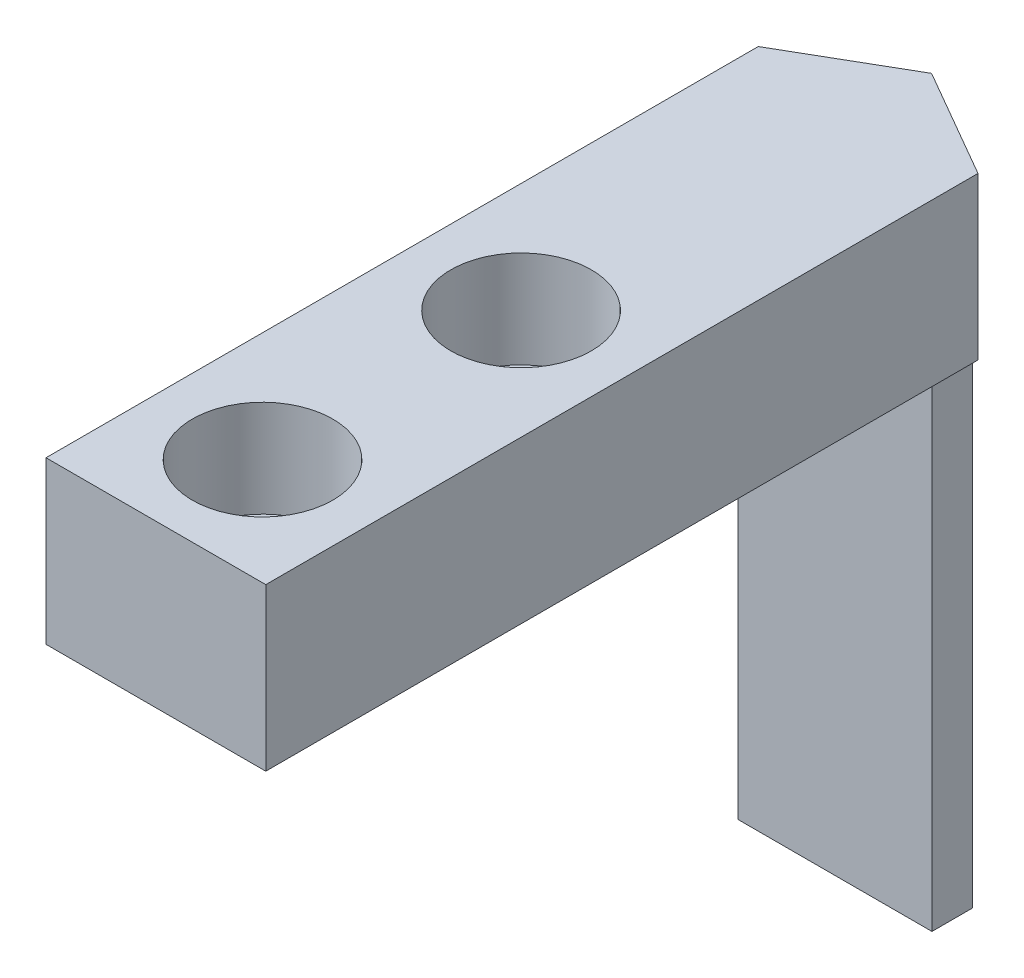
ISO-10303-21;
HEADER;
FILE_DESCRIPTION(('STEP AP214'),'2;1');
FILE_NAME('part.step','',(''),(''),'','','');
FILE_SCHEMA(('AUTOMOTIVE_DESIGN { 1 0 10303 214 1 1 1 1 }'));
ENDSEC;
DATA;
#1=APPLICATION_CONTEXT('core data for automotive mechanical design processes');
#2=APPLICATION_PROTOCOL_DEFINITION('international standard','automotive_design',2000,#1);
#3=PRODUCT_CONTEXT('',#1,'mechanical');
#4=PRODUCT('Part','Part','',(#3));
#5=PRODUCT_RELATED_PRODUCT_CATEGORY('part','',(#4));
#6=PRODUCT_DEFINITION_FORMATION('','',#4);
#7=PRODUCT_DEFINITION_CONTEXT('part definition',#1,'design');
#8=PRODUCT_DEFINITION('design','',#6,#7);
#9=PRODUCT_DEFINITION_SHAPE('','',#8);
#10=(LENGTH_UNIT() NAMED_UNIT(*) SI_UNIT(.MILLI.,.METRE.));
#11=(NAMED_UNIT(*) PLANE_ANGLE_UNIT() SI_UNIT($,.RADIAN.));
#12=(NAMED_UNIT(*) SI_UNIT($,.STERADIAN.) SOLID_ANGLE_UNIT());
#13=UNCERTAINTY_MEASURE_WITH_UNIT(LENGTH_MEASURE(1.E-05),#10,'distance_accuracy_value','');
#14=(GEOMETRIC_REPRESENTATION_CONTEXT(3) GLOBAL_UNCERTAINTY_ASSIGNED_CONTEXT((#13)) GLOBAL_UNIT_ASSIGNED_CONTEXT((#10,
#11,#12)) REPRESENTATION_CONTEXT('',''));
#15=CARTESIAN_POINT('',(0.,0.,0.));
#16=DIRECTION('',(0.,0.,1.));
#17=DIRECTION('',(1.,0.,0.));
#18=AXIS2_PLACEMENT_3D('',#15,#16,#17);
#19=CARTESIAN_POINT('',(0.,-5.,20.7));
#20=DIRECTION('',(0.,1.,0.));
#21=DIRECTION('',(-1.,0.,0.));
#22=AXIS2_PLACEMENT_3D('',#19,#20,#21);
#23=CYLINDRICAL_SURFACE('',#22,2.175);
#24=CARTESIAN_POINT('',(0.,0.,20.7));
#25=DIRECTION('',(0.,-1.,0.));
#26=DIRECTION('',(1.,0.,0.));
#27=AXIS2_PLACEMENT_3D('',#24,#25,#26);
#28=CIRCLE('',#27,2.175);
#29=CARTESIAN_POINT('',(2.175,0.,20.7));
#30=VERTEX_POINT('',#29);
#31=EDGE_CURVE('E11',#30,#30,#28,.T.);
#32=ORIENTED_EDGE('',*,*,#31,.F.);
#33=EDGE_LOOP('',(#32));
#34=FACE_BOUND('',#33,.T.);
#35=CARTESIAN_POINT('',(0.,-3.,20.7));
#36=DIRECTION('',(0.,-1.,0.));
#37=DIRECTION('',(1.,0.,0.));
#38=AXIS2_PLACEMENT_3D('',#35,#36,#37);
#39=CIRCLE('',#38,2.175);
#40=CARTESIAN_POINT('',(2.175,-3.,20.7));
#41=VERTEX_POINT('',#40);
#42=EDGE_CURVE('E25',#41,#41,#39,.T.);
#43=ORIENTED_EDGE('',*,*,#42,.T.);
#44=EDGE_LOOP('',(#43));
#45=FACE_BOUND('',#44,.T.);
#46=ADVANCED_FACE('F17',(#34,#45),#23,.F.);
#47=CARTESIAN_POINT('',(0.,-5.,12.7));
#48=DIRECTION('',(0.,1.,0.));
#49=DIRECTION('',(-1.,0.,0.));
#50=AXIS2_PLACEMENT_3D('',#47,#48,#49);
#51=CYLINDRICAL_SURFACE('',#50,2.175);
#52=CARTESIAN_POINT('',(0.,0.,12.7));
#53=DIRECTION('',(0.,-1.,0.));
#54=DIRECTION('',(1.,0.,0.));
#55=AXIS2_PLACEMENT_3D('',#52,#53,#54);
#56=CIRCLE('',#55,2.175);
#57=CARTESIAN_POINT('',(2.175,0.,12.7));
#58=VERTEX_POINT('',#57);
#59=EDGE_CURVE('E213',#58,#58,#56,.T.);
#60=ORIENTED_EDGE('',*,*,#59,.F.);
#61=EDGE_LOOP('',(#60));
#62=FACE_BOUND('',#61,.T.);
#63=CARTESIAN_POINT('',(0.,-3.,12.7));
#64=DIRECTION('',(0.,-1.,0.));
#65=DIRECTION('',(1.,0.,0.));
#66=AXIS2_PLACEMENT_3D('',#63,#64,#65);
#67=CIRCLE('',#66,2.175);
#68=CARTESIAN_POINT('',(2.175,-3.,12.7));
#69=VERTEX_POINT('',#68);
#70=EDGE_CURVE('E209',#69,#69,#67,.T.);
#71=ORIENTED_EDGE('',*,*,#70,.T.);
#72=EDGE_LOOP('',(#71));
#73=FACE_BOUND('',#72,.T.);
#74=ADVANCED_FACE('F240',(#62,#73),#51,.F.);
#75=CARTESIAN_POINT('',(0.,-5.,0.));
#76=DIRECTION('',(0.,-1.,0.));
#77=DIRECTION('',(1.,0.,0.));
#78=AXIS2_PLACEMENT_3D('',#75,#76,#77);
#79=PLANE('',#78);
#80=DIRECTION('',(0.,0.,-1.));
#81=VECTOR('',#80,1.);
#82=CARTESIAN_POINT('',(3.,-5.,0.));
#83=LINE('',#82,#81);
#84=CARTESIAN_POINT('',(3.,-5.,2.98776399621542));
#85=VERTEX_POINT('',#84);
#86=CARTESIAN_POINT('',(3.,-5.,1.73205080756885));
#87=VERTEX_POINT('',#86);
#88=EDGE_CURVE('E32',#85,#87,#83,.T.);
#89=ORIENTED_EDGE('',*,*,#88,.T.);
#90=DIRECTION('',(0.866025403784439,0.,0.499999999999999));
#91=VECTOR('',#90,1.);
#92=CARTESIAN_POINT('',(0.,-5.,0.));
#93=LINE('',#92,#91);
#94=CARTESIAN_POINT('',(3.4,-5.,1.9629909152447));
#95=VERTEX_POINT('',#94);
#96=EDGE_CURVE('E37',#87,#95,#93,.T.);
#97=ORIENTED_EDGE('',*,*,#96,.T.);
#98=DIRECTION('',(0.,0.,1.));
#99=VECTOR('',#98,1.);
#100=CARTESIAN_POINT('',(3.4,-5.,0.));
#101=LINE('',#100,#99);
#102=CARTESIAN_POINT('',(3.4,-5.,24.));
#103=VERTEX_POINT('',#102);
#104=EDGE_CURVE('E202',#95,#103,#101,.T.);
#105=ORIENTED_EDGE('',*,*,#104,.T.);
#106=DIRECTION('',(-1.,0.,0.));
#107=VECTOR('',#106,1.);
#108=CARTESIAN_POINT('',(-3.4,-5.,24.));
#109=LINE('',#108,#107);
#110=CARTESIAN_POINT('',(-3.4,-5.,24.));
#111=VERTEX_POINT('',#110);
#112=EDGE_CURVE('E199',#103,#111,#109,.T.);
#113=ORIENTED_EDGE('',*,*,#112,.T.);
#114=DIRECTION('',(0.,0.,-1.));
#115=VECTOR('',#114,1.);
#116=CARTESIAN_POINT('',(-3.4,-5.,24.));
#117=LINE('',#116,#115);
#118=CARTESIAN_POINT('',(-3.4,-5.,1.9629909152447));
#119=VERTEX_POINT('',#118);
#120=EDGE_CURVE('E196',#111,#119,#117,.T.);
#121=ORIENTED_EDGE('',*,*,#120,.T.);
#122=DIRECTION('',(0.866025403784439,0.,-0.499999999999999));
#123=VECTOR('',#122,1.);
#124=CARTESIAN_POINT('',(0.,-5.,0.));
#125=LINE('',#124,#123);
#126=CARTESIAN_POINT('',(-3.,-5.,1.73205080756886));
#127=VERTEX_POINT('',#126);
#128=EDGE_CURVE('E193',#119,#127,#125,.T.);
#129=ORIENTED_EDGE('',*,*,#128,.T.);
#130=DIRECTION('',(0.,0.,-1.));
#131=VECTOR('',#130,1.);
#132=CARTESIAN_POINT('',(-3.,-5.,0.));
#133=LINE('',#132,#131);
#134=CARTESIAN_POINT('',(-3.,-5.,2.98776399621542));
#135=VERTEX_POINT('',#134);
#136=EDGE_CURVE('E189',#135,#127,#133,.T.);
#137=ORIENTED_EDGE('',*,*,#136,.F.);
#138=DIRECTION('',(1.,0.,0.));
#139=VECTOR('',#138,1.);
#140=CARTESIAN_POINT('',(0.,-5.,2.98776399621542));
#141=LINE('',#140,#139);
#142=EDGE_CURVE('E186',#135,#85,#141,.T.);
#143=ORIENTED_EDGE('',*,*,#142,.T.);
#144=EDGE_LOOP('',(#89,#97,#105,#113,#121,#129,#137,#143));
#145=FACE_BOUND('',#144,.T.);
#146=CARTESIAN_POINT('',(0.,-5.,12.7));
#147=DIRECTION('',(0.,-1.,0.));
#148=DIRECTION('',(1.,0.,0.));
#149=AXIS2_PLACEMENT_3D('',#146,#147,#148);
#150=CIRCLE('',#149,1.175);
#151=CARTESIAN_POINT('',(1.175,-5.,12.7));
#152=VERTEX_POINT('',#151);
#153=EDGE_CURVE('E182',#152,#152,#150,.T.);
#154=ORIENTED_EDGE('',*,*,#153,.F.);
#155=EDGE_LOOP('',(#154));
#156=FACE_BOUND('',#155,.T.);
#157=CARTESIAN_POINT('',(0.,-5.,20.7));
#158=DIRECTION('',(0.,-1.,0.));
#159=DIRECTION('',(1.,0.,0.));
#160=AXIS2_PLACEMENT_3D('',#157,#158,#159);
#161=CIRCLE('',#160,1.175);
#162=CARTESIAN_POINT('',(1.175,-5.,20.7));
#163=VERTEX_POINT('',#162);
#164=EDGE_CURVE('E178',#163,#163,#161,.T.);
#165=ORIENTED_EDGE('',*,*,#164,.F.);
#166=EDGE_LOOP('',(#165));
#167=FACE_BOUND('',#166,.T.);
#168=ADVANCED_FACE('F245',(#145,#156,#167),#79,.T.);
#169=CARTESIAN_POINT('',(0.,0.,0.));
#170=DIRECTION('',(0.,-1.,0.));
#171=DIRECTION('',(1.,0.,0.));
#172=AXIS2_PLACEMENT_3D('',#169,#170,#171);
#173=PLANE('',#172);
#174=ORIENTED_EDGE('',*,*,#31,.T.);
#175=EDGE_LOOP('',(#174));
#176=FACE_BOUND('',#175,.T.);
#177=ORIENTED_EDGE('',*,*,#59,.T.);
#178=EDGE_LOOP('',(#177));
#179=FACE_BOUND('',#178,.T.);
#180=DIRECTION('',(0.866025403784439,0.,0.499999999999999));
#181=VECTOR('',#180,1.);
#182=CARTESIAN_POINT('',(0.,0.,0.));
#183=LINE('',#182,#181);
#184=CARTESIAN_POINT('',(0.,0.,0.));
#185=VERTEX_POINT('',#184);
#186=CARTESIAN_POINT('',(3.4,0.,1.9629909152447));
#187=VERTEX_POINT('',#186);
#188=EDGE_CURVE('E175',#185,#187,#183,.T.);
#189=ORIENTED_EDGE('',*,*,#188,.F.);
#190=DIRECTION('',(0.866025403784439,0.,-0.499999999999999));
#191=VECTOR('',#190,1.);
#192=CARTESIAN_POINT('',(0.,0.,0.));
#193=LINE('',#192,#191);
#194=CARTESIAN_POINT('',(-3.4,0.,1.9629909152447));
#195=VERTEX_POINT('',#194);
#196=EDGE_CURVE('E107',#195,#185,#193,.T.);
#197=ORIENTED_EDGE('',*,*,#196,.F.);
#198=DIRECTION('',(0.,0.,-1.));
#199=VECTOR('',#198,1.);
#200=CARTESIAN_POINT('',(-3.4,0.,11.2734656544931));
#201=LINE('',#200,#199);
#202=CARTESIAN_POINT('',(-3.4,0.,24.));
#203=VERTEX_POINT('',#202);
#204=EDGE_CURVE('E169',#203,#195,#201,.T.);
#205=ORIENTED_EDGE('',*,*,#204,.F.);
#206=DIRECTION('',(-1.,0.,0.));
#207=VECTOR('',#206,1.);
#208=CARTESIAN_POINT('',(-3.4,0.,24.));
#209=LINE('',#208,#207);
#210=CARTESIAN_POINT('',(3.4,0.,24.));
#211=VERTEX_POINT('',#210);
#212=EDGE_CURVE('E165',#211,#203,#209,.T.);
#213=ORIENTED_EDGE('',*,*,#212,.F.);
#214=DIRECTION('',(0.,0.,1.));
#215=VECTOR('',#214,1.);
#216=CARTESIAN_POINT('',(3.4,0.,24.));
#217=LINE('',#216,#215);
#218=EDGE_CURVE('E161',#187,#211,#217,.T.);
#219=ORIENTED_EDGE('',*,*,#218,.F.);
#220=EDGE_LOOP('',(#189,#197,#205,#213,#219));
#221=FACE_BOUND('',#220,.T.);
#222=ADVANCED_FACE('F249',(#176,#179,#221),#173,.F.);
#223=CARTESIAN_POINT('',(3.4,-5.,24.));
#224=DIRECTION('',(-1.,0.,0.));
#225=DIRECTION('',(0.,-1.,0.));
#226=AXIS2_PLACEMENT_3D('',#223,#224,#225);
#227=PLANE('',#226);
#228=DIRECTION('',(0.,-1.,0.));
#229=VECTOR('',#228,1.);
#230=CARTESIAN_POINT('',(3.4,5.,1.9629909152447));
#231=LINE('',#230,#229);
#232=EDGE_CURVE('E157',#187,#95,#231,.T.);
#233=ORIENTED_EDGE('',*,*,#232,.F.);
#234=ORIENTED_EDGE('',*,*,#218,.T.);
#235=DIRECTION('',(0.,1.,0.));
#236=VECTOR('',#235,1.);
#237=CARTESIAN_POINT('',(3.4,-5.,24.));
#238=LINE('',#237,#236);
#239=EDGE_CURVE('E153',#103,#211,#238,.T.);
#240=ORIENTED_EDGE('',*,*,#239,.F.);
#241=ORIENTED_EDGE('',*,*,#104,.F.);
#242=EDGE_LOOP('',(#233,#234,#240,#241));
#243=FACE_BOUND('',#242,.T.);
#244=ADVANCED_FACE('F252',(#243),#227,.F.);
#245=CARTESIAN_POINT('',(-3.4,-5.,11.2734656544931));
#246=DIRECTION('',(1.,0.,0.));
#247=DIRECTION('',(0.,0.,1.));
#248=AXIS2_PLACEMENT_3D('',#245,#246,#247);
#249=PLANE('',#248);
#250=DIRECTION('',(0.,-1.,0.));
#251=VECTOR('',#250,1.);
#252=CARTESIAN_POINT('',(-3.4,5.,1.9629909152447));
#253=LINE('',#252,#251);
#254=EDGE_CURVE('E149',#195,#119,#253,.T.);
#255=ORIENTED_EDGE('',*,*,#254,.T.);
#256=ORIENTED_EDGE('',*,*,#120,.F.);
#257=DIRECTION('',(0.,1.,0.));
#258=VECTOR('',#257,1.);
#259=CARTESIAN_POINT('',(-3.4,-5.,24.));
#260=LINE('',#259,#258);
#261=EDGE_CURVE('E145',#111,#203,#260,.T.);
#262=ORIENTED_EDGE('',*,*,#261,.T.);
#263=ORIENTED_EDGE('',*,*,#204,.T.);
#264=EDGE_LOOP('',(#255,#256,#262,#263));
#265=FACE_BOUND('',#264,.T.);
#266=ADVANCED_FACE('F265',(#265),#249,.F.);
#267=CARTESIAN_POINT('',(-3.4,-5.,24.));
#268=DIRECTION('',(0.,0.,-1.));
#269=DIRECTION('',(0.,1.,0.));
#270=AXIS2_PLACEMENT_3D('',#267,#268,#269);
#271=PLANE('',#270);
#272=ORIENTED_EDGE('',*,*,#212,.T.);
#273=ORIENTED_EDGE('',*,*,#261,.F.);
#274=ORIENTED_EDGE('',*,*,#112,.F.);
#275=ORIENTED_EDGE('',*,*,#239,.T.);
#276=EDGE_LOOP('',(#272,#273,#274,#275));
#277=FACE_BOUND('',#276,.T.);
#278=ADVANCED_FACE('F267',(#277),#271,.F.);
#279=CARTESIAN_POINT('',(-3.,-5.,0.));
#280=DIRECTION('',(-1.,0.,0.));
#281=DIRECTION('',(0.,0.,-1.));
#282=AXIS2_PLACEMENT_3D('',#279,#280,#281);
#283=PLANE('',#282);
#284=DIRECTION('',(0.,-1.,0.));
#285=VECTOR('',#284,1.);
#286=CARTESIAN_POINT('',(-3.,-5.,1.7320508075689));
#287=LINE('',#286,#285);
#288=CARTESIAN_POINT('',(-3.,-20.,1.7320508075689));
#289=VERTEX_POINT('',#288);
#290=EDGE_CURVE('E142',#127,#289,#287,.T.);
#291=ORIENTED_EDGE('',*,*,#290,.T.);
#292=DIRECTION('',(0.,0.,-1.));
#293=VECTOR('',#292,1.);
#294=CARTESIAN_POINT('',(-3.,-20.,2.98776399621542));
#295=LINE('',#294,#293);
#296=CARTESIAN_POINT('',(-3.,-20.,2.98776399621542));
#297=VERTEX_POINT('',#296);
#298=EDGE_CURVE('E112',#297,#289,#295,.T.);
#299=ORIENTED_EDGE('',*,*,#298,.F.);
#300=DIRECTION('',(0.,-1.,0.));
#301=VECTOR('',#300,1.);
#302=CARTESIAN_POINT('',(-3.,-5.,2.98776399621542));
#303=LINE('',#302,#301);
#304=EDGE_CURVE('E136',#135,#297,#303,.T.);
#305=ORIENTED_EDGE('',*,*,#304,.F.);
#306=ORIENTED_EDGE('',*,*,#136,.T.);
#307=EDGE_LOOP('',(#291,#299,#305,#306));
#308=FACE_BOUND('',#307,.T.);
#309=ADVANCED_FACE('F270',(#308),#283,.T.);
#310=CARTESIAN_POINT('',(0.,-5.,2.98776399621542));
#311=DIRECTION('',(0.,0.,-1.));
#312=DIRECTION('',(0.,1.,0.));
#313=AXIS2_PLACEMENT_3D('',#310,#311,#312);
#314=PLANE('',#313);
#315=ORIENTED_EDGE('',*,*,#304,.T.);
#316=DIRECTION('',(-1.,0.,0.));
#317=VECTOR('',#316,1.);
#318=CARTESIAN_POINT('',(3.,-20.,2.98776399621542));
#319=LINE('',#318,#317);
#320=CARTESIAN_POINT('',(3.,-20.,2.98776399621542));
#321=VERTEX_POINT('',#320);
#322=EDGE_CURVE('E133',#321,#297,#319,.T.);
#323=ORIENTED_EDGE('',*,*,#322,.F.);
#324=DIRECTION('',(0.,-1.,0.));
#325=VECTOR('',#324,1.);
#326=CARTESIAN_POINT('',(3.,-5.,2.98776399621542));
#327=LINE('',#326,#325);
#328=EDGE_CURVE('E129',#85,#321,#327,.T.);
#329=ORIENTED_EDGE('',*,*,#328,.F.);
#330=ORIENTED_EDGE('',*,*,#142,.F.);
#331=EDGE_LOOP('',(#315,#323,#329,#330));
#332=FACE_BOUND('',#331,.T.);
#333=ADVANCED_FACE('F274',(#332),#314,.F.);
#334=CARTESIAN_POINT('',(3.,-5.,0.));
#335=DIRECTION('',(-1.,0.,0.));
#336=DIRECTION('',(0.,-1.,0.));
#337=AXIS2_PLACEMENT_3D('',#334,#335,#336);
#338=PLANE('',#337);
#339=ORIENTED_EDGE('',*,*,#328,.T.);
#340=DIRECTION('',(0.,0.,1.));
#341=VECTOR('',#340,1.);
#342=CARTESIAN_POINT('',(3.,-20.,1.73205080756884));
#343=LINE('',#342,#341);
#344=CARTESIAN_POINT('',(3.,-20.,1.73205080756884));
#345=VERTEX_POINT('',#344);
#346=EDGE_CURVE('E126',#345,#321,#343,.T.);
#347=ORIENTED_EDGE('',*,*,#346,.F.);
#348=DIRECTION('',(0.,-1.,0.));
#349=VECTOR('',#348,1.);
#350=CARTESIAN_POINT('',(3.,-5.,1.73205080756884));
#351=LINE('',#350,#349);
#352=EDGE_CURVE('E94',#87,#345,#351,.T.);
#353=ORIENTED_EDGE('',*,*,#352,.F.);
#354=ORIENTED_EDGE('',*,*,#88,.F.);
#355=EDGE_LOOP('',(#339,#347,#353,#354));
#356=FACE_BOUND('',#355,.T.);
#357=ADVANCED_FACE('F276',(#356),#338,.F.);
#358=CARTESIAN_POINT('',(0.,-5.,0.));
#359=DIRECTION('',(0.499999999999993,0.,-0.866025403784443));
#360=DIRECTION('',(0.866025403784443,0.,0.499999999999993));
#361=AXIS2_PLACEMENT_3D('',#358,#359,#360);
#362=PLANE('',#361);
#363=ORIENTED_EDGE('',*,*,#352,.T.);
#364=DIRECTION('',(0.866025403784443,0.,0.499999999999993));
#365=VECTOR('',#364,1.);
#366=CARTESIAN_POINT('',(0.,-20.,0.));
#367=LINE('',#366,#365);
#368=CARTESIAN_POINT('',(0.,-20.,0.));
#369=VERTEX_POINT('',#368);
#370=EDGE_CURVE('E88',#369,#345,#367,.T.);
#371=ORIENTED_EDGE('',*,*,#370,.F.);
#372=DIRECTION('',(0.,-1.,0.));
#373=VECTOR('',#372,1.);
#374=CARTESIAN_POINT('',(0.,-5.,0.));
#375=LINE('',#374,#373);
#376=EDGE_CURVE('E92',#185,#369,#375,.T.);
#377=ORIENTED_EDGE('',*,*,#376,.F.);
#378=ORIENTED_EDGE('',*,*,#188,.T.);
#379=ORIENTED_EDGE('',*,*,#232,.T.);
#380=ORIENTED_EDGE('',*,*,#96,.F.);
#381=EDGE_LOOP('',(#363,#371,#377,#378,#379,#380));
#382=FACE_BOUND('',#381,.T.);
#383=ADVANCED_FACE('F90',(#382),#362,.T.);
#384=CARTESIAN_POINT('',(0.,-5.,0.));
#385=DIRECTION('',(-0.5,0.,-0.866025403784437));
#386=DIRECTION('',(0.866025403784437,0.,-0.5));
#387=AXIS2_PLACEMENT_3D('',#384,#385,#386);
#388=PLANE('',#387);
#389=ORIENTED_EDGE('',*,*,#376,.T.);
#390=DIRECTION('',(0.866025403784438,0.,-0.500000000000001));
#391=VECTOR('',#390,1.);
#392=CARTESIAN_POINT('',(-3.,-20.,1.7320508075689));
#393=LINE('',#392,#391);
#394=EDGE_CURVE('E104',#289,#369,#393,.T.);
#395=ORIENTED_EDGE('',*,*,#394,.F.);
#396=ORIENTED_EDGE('',*,*,#290,.F.);
#397=ORIENTED_EDGE('',*,*,#128,.F.);
#398=ORIENTED_EDGE('',*,*,#254,.F.);
#399=ORIENTED_EDGE('',*,*,#196,.T.);
#400=EDGE_LOOP('',(#389,#395,#396,#397,#398,#399));
#401=FACE_BOUND('',#400,.T.);
#402=ADVANCED_FACE('F102',(#401),#388,.T.);
#403=CARTESIAN_POINT('',(0.,-3.,12.7));
#404=DIRECTION('',(0.,-1.,0.));
#405=DIRECTION('',(1.,0.,0.));
#406=AXIS2_PLACEMENT_3D('',#403,#404,#405);
#407=PLANE('',#406);
#408=CARTESIAN_POINT('',(0.,-3.,12.7));
#409=DIRECTION('',(0.,-1.,0.));
#410=DIRECTION('',(1.,0.,0.));
#411=AXIS2_PLACEMENT_3D('',#408,#409,#410);
#412=CIRCLE('',#411,1.175);
#413=CARTESIAN_POINT('',(1.175,-3.,12.7));
#414=VERTEX_POINT('',#413);
#415=EDGE_CURVE('E114',#414,#414,#412,.T.);
#416=ORIENTED_EDGE('',*,*,#415,.T.);
#417=EDGE_LOOP('',(#416));
#418=FACE_BOUND('',#417,.T.);
#419=ORIENTED_EDGE('',*,*,#70,.F.);
#420=EDGE_LOOP('',(#419));
#421=FACE_BOUND('',#420,.T.);
#422=ADVANCED_FACE('F235',(#418,#421),#407,.F.);
#423=CARTESIAN_POINT('',(0.,-3.,12.7));
#424=DIRECTION('',(0.,-1.,0.));
#425=DIRECTION('',(1.,0.,0.));
#426=AXIS2_PLACEMENT_3D('',#423,#424,#425);
#427=CYLINDRICAL_SURFACE('',#426,1.175);
#428=ORIENTED_EDGE('',*,*,#415,.F.);
#429=EDGE_LOOP('',(#428));
#430=FACE_BOUND('',#429,.T.);
#431=ORIENTED_EDGE('',*,*,#153,.T.);
#432=EDGE_LOOP('',(#431));
#433=FACE_BOUND('',#432,.T.);
#434=ADVANCED_FACE('F225',(#430,#433),#427,.F.);
#435=CARTESIAN_POINT('',(0.,-3.,20.7));
#436=DIRECTION('',(0.,-1.,0.));
#437=DIRECTION('',(1.,0.,0.));
#438=AXIS2_PLACEMENT_3D('',#435,#436,#437);
#439=PLANE('',#438);
#440=CARTESIAN_POINT('',(0.,-3.,20.7));
#441=DIRECTION('',(0.,-1.,0.));
#442=DIRECTION('',(1.,0.,0.));
#443=AXIS2_PLACEMENT_3D('',#440,#441,#442);
#444=CIRCLE('',#443,1.175);
#445=CARTESIAN_POINT('',(1.175,-3.,20.7));
#446=VERTEX_POINT('',#445);
#447=EDGE_CURVE('E120',#446,#446,#444,.T.);
#448=ORIENTED_EDGE('',*,*,#447,.T.);
#449=EDGE_LOOP('',(#448));
#450=FACE_BOUND('',#449,.T.);
#451=ORIENTED_EDGE('',*,*,#42,.F.);
#452=EDGE_LOOP('',(#451));
#453=FACE_BOUND('',#452,.T.);
#454=ADVANCED_FACE('F222',(#450,#453),#439,.F.);
#455=CARTESIAN_POINT('',(0.,-3.,20.7));
#456=DIRECTION('',(0.,-1.,0.));
#457=DIRECTION('',(1.,0.,0.));
#458=AXIS2_PLACEMENT_3D('',#455,#456,#457);
#459=CYLINDRICAL_SURFACE('',#458,1.175);
#460=ORIENTED_EDGE('',*,*,#447,.F.);
#461=EDGE_LOOP('',(#460));
#462=FACE_BOUND('',#461,.T.);
#463=ORIENTED_EDGE('',*,*,#164,.T.);
#464=EDGE_LOOP('',(#463));
#465=FACE_BOUND('',#464,.T.);
#466=ADVANCED_FACE('F224',(#462,#465),#459,.F.);
#467=CARTESIAN_POINT('',(0.,-20.,0.));
#468=DIRECTION('',(0.,-1.,0.));
#469=DIRECTION('',(1.,0.,0.));
#470=AXIS2_PLACEMENT_3D('',#467,#468,#469);
#471=PLANE('',#470);
#472=ORIENTED_EDGE('',*,*,#322,.T.);
#473=ORIENTED_EDGE('',*,*,#298,.T.);
#474=ORIENTED_EDGE('',*,*,#394,.T.);
#475=ORIENTED_EDGE('',*,*,#370,.T.);
#476=ORIENTED_EDGE('',*,*,#346,.T.);
#477=EDGE_LOOP('',(#472,#473,#474,#475,#476));
#478=FACE_BOUND('',#477,.T.);
#479=ADVANCED_FACE('F111',(#478),#471,.T.);
#480=CLOSED_SHELL('',(#46,#74,#168,#222,#244,#266,#278,#309,#333,#357,#383,#402,#422,#434,#454,
#466,#479));
#481=MANIFOLD_SOLID_BREP('B1',#480);
#482=ADVANCED_BREP_SHAPE_REPRESENTATION('',(#18,#481),#14);
#483=SHAPE_DEFINITION_REPRESENTATION(#9,#482);
ENDSEC;
END-ISO-10303-21;
